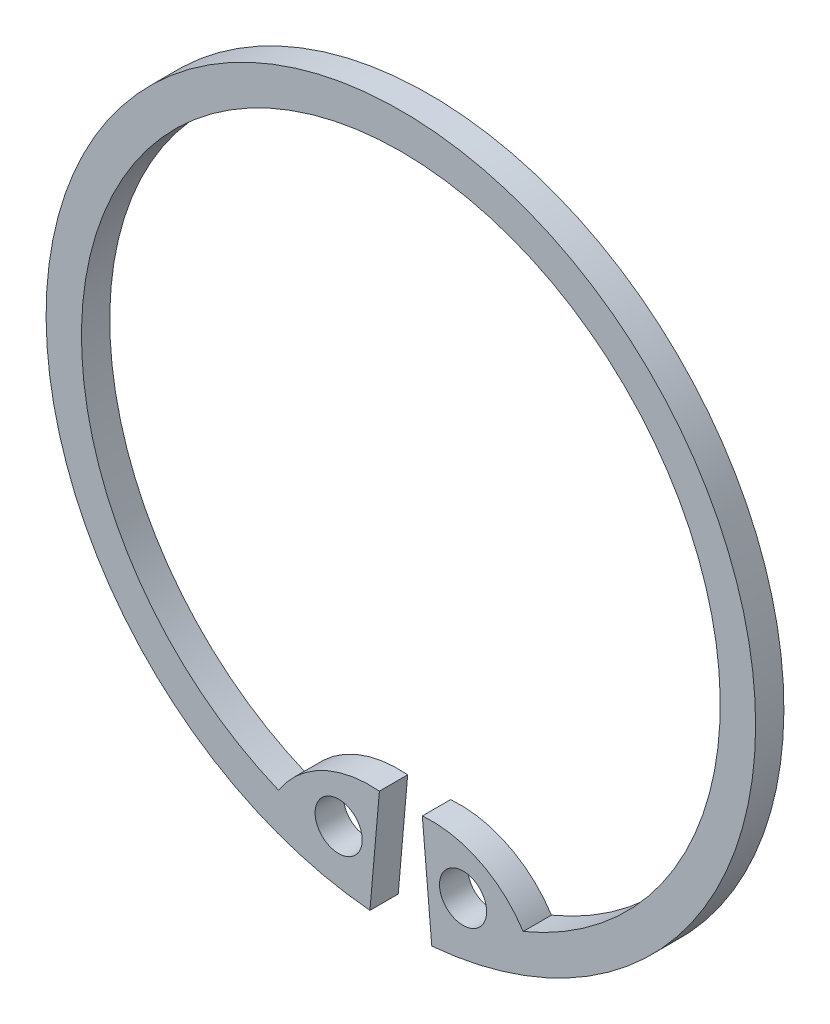
ISO-10303-21;
HEADER;
FILE_DESCRIPTION(('STEP AP214'),'2;1');
FILE_NAME('part.step','',(''),(''),'','','');
FILE_SCHEMA(('AUTOMOTIVE_DESIGN { 1 0 10303 214 1 1 1 1 }'));
ENDSEC;
DATA;
#1=APPLICATION_CONTEXT('core data for automotive mechanical design processes');
#2=APPLICATION_PROTOCOL_DEFINITION('international standard','automotive_design',2000,#1);
#3=PRODUCT_CONTEXT('',#1,'mechanical');
#4=PRODUCT('Part','Part','',(#3));
#5=PRODUCT_RELATED_PRODUCT_CATEGORY('part','',(#4));
#6=PRODUCT_DEFINITION_FORMATION('','',#4);
#7=PRODUCT_DEFINITION_CONTEXT('part definition',#1,'design');
#8=PRODUCT_DEFINITION('design','',#6,#7);
#9=PRODUCT_DEFINITION_SHAPE('','',#8);
#10=(LENGTH_UNIT() NAMED_UNIT(*) SI_UNIT(.MILLI.,.METRE.));
#11=(NAMED_UNIT(*) PLANE_ANGLE_UNIT() SI_UNIT($,.RADIAN.));
#12=(NAMED_UNIT(*) SI_UNIT($,.STERADIAN.) SOLID_ANGLE_UNIT());
#13=UNCERTAINTY_MEASURE_WITH_UNIT(LENGTH_MEASURE(1.E-05),#10,'distance_accuracy_value','');
#14=(GEOMETRIC_REPRESENTATION_CONTEXT(3) GLOBAL_UNCERTAINTY_ASSIGNED_CONTEXT((#13)) GLOBAL_UNIT_ASSIGNED_CONTEXT((#10,
#11,#12)) REPRESENTATION_CONTEXT('',''));
#15=CARTESIAN_POINT('',(0.,0.,0.));
#16=DIRECTION('',(0.,0.,1.));
#17=DIRECTION('',(1.,0.,0.));
#18=AXIS2_PLACEMENT_3D('',#15,#16,#17);
#19=CARTESIAN_POINT('',(0.,0.,1.2));
#20=DIRECTION('',(0.,0.,1.));
#21=DIRECTION('',(1.,0.,0.));
#22=AXIS2_PLACEMENT_3D('',#19,#20,#21);
#23=PLANE('',#22);
#24=CARTESIAN_POINT('',(2.63873425710665,-12.5678435951233,1.2));
#25=DIRECTION('',(0.,0.,1.));
#26=DIRECTION('',(1.,0.,0.));
#27=AXIS2_PLACEMENT_3D('',#24,#25,#26);
#28=CIRCLE('',#27,1.);
#29=CARTESIAN_POINT('',(3.63873425710665,-12.5678435951233,1.2));
#30=VERTEX_POINT('',#29);
#31=EDGE_CURVE('E122',#30,#30,#28,.T.);
#32=ORIENTED_EDGE('',*,*,#31,.F.);
#33=EDGE_LOOP('',(#32));
#34=FACE_BOUND('',#33,.T.);
#35=CARTESIAN_POINT('',(0.,0.,1.2));
#36=DIRECTION('',(0.,0.,1.));
#37=DIRECTION('',(1.,0.,0.));
#38=AXIS2_PLACEMENT_3D('',#35,#36,#37);
#39=CIRCLE('',#38,15.05);
#40=CARTESIAN_POINT('',(1.31169392835226,-14.9927302062808,1.2));
#41=VERTEX_POINT('',#40);
#42=CARTESIAN_POINT('',(-1.31169392835226,-14.9927302062808,1.2));
#43=VERTEX_POINT('',#42);
#44=EDGE_CURVE('E129',#41,#43,#39,.T.);
#45=ORIENTED_EDGE('',*,*,#44,.T.);
#46=DIRECTION('',(0.0871557427476582,0.996194698091745,0.));
#47=VECTOR('',#46,1.);
#48=CARTESIAN_POINT('',(-1.31169392835226,-14.9927302062808,1.2));
#49=LINE('',#48,#47);
#50=CARTESIAN_POINT('',(-0.910777511713028,-10.4102345950587,1.2));
#51=VERTEX_POINT('',#50);
#52=EDGE_CURVE('E87',#43,#51,#49,.T.);
#53=ORIENTED_EDGE('',*,*,#52,.T.);
#54=CARTESIAN_POINT('',(-1.31169392835226,-14.9927302062808,1.2));
#55=DIRECTION('',(0.,0.,1.));
#56=DIRECTION('',(1.,0.,0.));
#57=AXIS2_PLACEMENT_3D('',#54,#55,#56);
#58=CIRCLE('',#57,4.6);
#59=CARTESIAN_POINT('',(-5.18875040683786,-12.5171629858982,1.2));
#60=VERTEX_POINT('',#59);
#61=EDGE_CURVE('E100',#51,#60,#58,.T.);
#62=ORIENTED_EDGE('',*,*,#61,.T.);
#63=CARTESIAN_POINT('',(0.,0.,1.2));
#64=DIRECTION('',(0.,0.,-1.));
#65=DIRECTION('',(-1.,0.,0.));
#66=AXIS2_PLACEMENT_3D('',#63,#64,#65);
#67=CIRCLE('',#66,13.55);
#68=CARTESIAN_POINT('',(5.18875040683787,-12.5171629858982,1.2));
#69=VERTEX_POINT('',#68);
#70=EDGE_CURVE('E94',#60,#69,#67,.T.);
#71=ORIENTED_EDGE('',*,*,#70,.T.);
#72=CARTESIAN_POINT('',(1.31169392835226,-14.9927302062808,1.2));
#73=DIRECTION('',(0.,0.,1.));
#74=DIRECTION('',(1.,0.,0.));
#75=AXIS2_PLACEMENT_3D('',#72,#73,#74);
#76=CIRCLE('',#75,4.6);
#77=CARTESIAN_POINT('',(0.910777511713028,-10.4102345950587,1.2));
#78=VERTEX_POINT('',#77);
#79=EDGE_CURVE('E98',#69,#78,#76,.T.);
#80=ORIENTED_EDGE('',*,*,#79,.T.);
#81=DIRECTION('',(0.0871557427476581,-0.996194698091745,0.));
#82=VECTOR('',#81,1.);
#83=CARTESIAN_POINT('',(0.910777511713028,-10.4102345950587,1.2));
#84=LINE('',#83,#82);
#85=EDGE_CURVE('E50',#78,#41,#84,.T.);
#86=ORIENTED_EDGE('',*,*,#85,.T.);
#87=EDGE_LOOP('',(#45,#53,#62,#71,#80,#86));
#88=FACE_BOUND('',#87,.T.);
#89=CARTESIAN_POINT('',(-2.63873425710665,-12.5678435951233,1.2));
#90=DIRECTION('',(0.,0.,1.));
#91=DIRECTION('',(1.,0.,0.));
#92=AXIS2_PLACEMENT_3D('',#89,#90,#91);
#93=CIRCLE('',#92,1.);
#94=CARTESIAN_POINT('',(-1.63873425710665,-12.5678435951233,1.2));
#95=VERTEX_POINT('',#94);
#96=EDGE_CURVE('E172',#95,#95,#93,.T.);
#97=ORIENTED_EDGE('',*,*,#96,.F.);
#98=EDGE_LOOP('',(#97));
#99=FACE_BOUND('',#98,.T.);
#100=ADVANCED_FACE('F33',(#34,#88,#99),#23,.T.);
#101=CARTESIAN_POINT('',(0.,0.,0.));
#102=DIRECTION('',(0.,0.,1.));
#103=DIRECTION('',(1.,0.,0.));
#104=AXIS2_PLACEMENT_3D('',#101,#102,#103);
#105=PLANE('',#104);
#106=CARTESIAN_POINT('',(2.63873425710665,-12.5678435951233,0.));
#107=DIRECTION('',(0.,0.,1.));
#108=DIRECTION('',(1.,0.,0.));
#109=AXIS2_PLACEMENT_3D('',#106,#107,#108);
#110=CIRCLE('',#109,1.);
#111=CARTESIAN_POINT('',(3.63873425710665,-12.5678435951233,0.));
#112=VERTEX_POINT('',#111);
#113=EDGE_CURVE('E177',#112,#112,#110,.T.);
#114=ORIENTED_EDGE('',*,*,#113,.T.);
#115=EDGE_LOOP('',(#114));
#116=FACE_BOUND('',#115,.T.);
#117=CARTESIAN_POINT('',(0.,0.,0.));
#118=DIRECTION('',(0.,0.,1.));
#119=DIRECTION('',(1.,0.,0.));
#120=AXIS2_PLACEMENT_3D('',#117,#118,#119);
#121=CIRCLE('',#120,15.05);
#122=CARTESIAN_POINT('',(1.31169392835226,-14.9927302062808,0.));
#123=VERTEX_POINT('',#122);
#124=CARTESIAN_POINT('',(-1.31169392835226,-14.9927302062808,0.));
#125=VERTEX_POINT('',#124);
#126=EDGE_CURVE('E118',#123,#125,#121,.T.);
#127=ORIENTED_EDGE('',*,*,#126,.F.);
#128=DIRECTION('',(0.0871557427476581,-0.996194698091745,0.));
#129=VECTOR('',#128,1.);
#130=CARTESIAN_POINT('',(0.910777511713028,-10.4102345950587,0.));
#131=LINE('',#130,#129);
#132=CARTESIAN_POINT('',(0.910777511713028,-10.4102345950587,0.));
#133=VERTEX_POINT('',#132);
#134=EDGE_CURVE('E79',#133,#123,#131,.T.);
#135=ORIENTED_EDGE('',*,*,#134,.F.);
#136=CARTESIAN_POINT('',(1.31169392835226,-14.9927302062808,0.));
#137=DIRECTION('',(0.,0.,1.));
#138=DIRECTION('',(1.,0.,0.));
#139=AXIS2_PLACEMENT_3D('',#136,#137,#138);
#140=CIRCLE('',#139,4.6);
#141=CARTESIAN_POINT('',(5.18875040683787,-12.5171629858982,0.));
#142=VERTEX_POINT('',#141);
#143=EDGE_CURVE('E73',#142,#133,#140,.T.);
#144=ORIENTED_EDGE('',*,*,#143,.F.);
#145=CARTESIAN_POINT('',(0.,0.,0.));
#146=DIRECTION('',(0.,0.,-1.));
#147=DIRECTION('',(-1.,0.,0.));
#148=AXIS2_PLACEMENT_3D('',#145,#146,#147);
#149=CIRCLE('',#148,13.55);
#150=CARTESIAN_POINT('',(-5.18875040683786,-12.5171629858982,0.));
#151=VERTEX_POINT('',#150);
#152=EDGE_CURVE('E108',#151,#142,#149,.T.);
#153=ORIENTED_EDGE('',*,*,#152,.F.);
#154=CARTESIAN_POINT('',(-1.31169392835226,-14.9927302062808,0.));
#155=DIRECTION('',(0.,0.,1.));
#156=DIRECTION('',(1.,0.,0.));
#157=AXIS2_PLACEMENT_3D('',#154,#155,#156);
#158=CIRCLE('',#157,4.6);
#159=CARTESIAN_POINT('',(-0.910777511713028,-10.4102345950587,0.));
#160=VERTEX_POINT('',#159);
#161=EDGE_CURVE('E124',#160,#151,#158,.T.);
#162=ORIENTED_EDGE('',*,*,#161,.F.);
#163=DIRECTION('',(0.0871557427476582,0.996194698091745,0.));
#164=VECTOR('',#163,1.);
#165=CARTESIAN_POINT('',(-1.31169392835226,-14.9927302062808,0.));
#166=LINE('',#165,#164);
#167=EDGE_CURVE('E121',#125,#160,#166,.T.);
#168=ORIENTED_EDGE('',*,*,#167,.F.);
#169=EDGE_LOOP('',(#127,#135,#144,#153,#162,#168));
#170=FACE_BOUND('',#169,.T.);
#171=CARTESIAN_POINT('',(-2.63873425710665,-12.5678435951233,0.));
#172=DIRECTION('',(0.,0.,1.));
#173=DIRECTION('',(1.,0.,0.));
#174=AXIS2_PLACEMENT_3D('',#171,#172,#173);
#175=CIRCLE('',#174,1.);
#176=CARTESIAN_POINT('',(-1.63873425710665,-12.5678435951233,0.));
#177=VERTEX_POINT('',#176);
#178=EDGE_CURVE('E175',#177,#177,#175,.T.);
#179=ORIENTED_EDGE('',*,*,#178,.T.);
#180=EDGE_LOOP('',(#179));
#181=FACE_BOUND('',#180,.T.);
#182=ADVANCED_FACE('F138',(#116,#170,#181),#105,.F.);
#183=CARTESIAN_POINT('',(0.,0.,1.2));
#184=DIRECTION('',(0.,0.,-1.));
#185=DIRECTION('',(-1.,0.,0.));
#186=AXIS2_PLACEMENT_3D('',#183,#184,#185);
#187=CYLINDRICAL_SURFACE('',#186,15.05);
#188=ORIENTED_EDGE('',*,*,#126,.T.);
#189=DIRECTION('',(0.,0.,-1.));
#190=VECTOR('',#189,1.);
#191=CARTESIAN_POINT('',(-1.31169392835226,-14.9927302062808,1.2));
#192=LINE('',#191,#190);
#193=EDGE_CURVE('E11',#43,#125,#192,.T.);
#194=ORIENTED_EDGE('',*,*,#193,.F.);
#195=ORIENTED_EDGE('',*,*,#44,.F.);
#196=DIRECTION('',(0.,0.,-1.));
#197=VECTOR('',#196,1.);
#198=CARTESIAN_POINT('',(1.31169392835226,-14.9927302062808,1.2));
#199=LINE('',#198,#197);
#200=EDGE_CURVE('E114',#41,#123,#199,.T.);
#201=ORIENTED_EDGE('',*,*,#200,.T.);
#202=EDGE_LOOP('',(#188,#194,#195,#201));
#203=FACE_BOUND('',#202,.T.);
#204=ADVANCED_FACE('F35',(#203),#187,.T.);
#205=CARTESIAN_POINT('',(-1.31169392835226,-14.9927302062808,1.2));
#206=DIRECTION('',(-0.996194698091745,0.0871557427476582,0.));
#207=DIRECTION('',(-0.0871557427476582,-0.996194698091746,0.));
#208=AXIS2_PLACEMENT_3D('',#205,#206,#207);
#209=PLANE('',#208);
#210=ORIENTED_EDGE('',*,*,#167,.T.);
#211=DIRECTION('',(0.,0.,-1.));
#212=VECTOR('',#211,1.);
#213=CARTESIAN_POINT('',(-0.910777511713028,-10.4102345950587,1.2));
#214=LINE('',#213,#212);
#215=EDGE_CURVE('E42',#51,#160,#214,.T.);
#216=ORIENTED_EDGE('',*,*,#215,.F.);
#217=ORIENTED_EDGE('',*,*,#52,.F.);
#218=ORIENTED_EDGE('',*,*,#193,.T.);
#219=EDGE_LOOP('',(#210,#216,#217,#218));
#220=FACE_BOUND('',#219,.T.);
#221=ADVANCED_FACE('F218',(#220),#209,.F.);
#222=CARTESIAN_POINT('',(-1.31169392835226,-14.9927302062808,1.2));
#223=DIRECTION('',(0.,0.,-1.));
#224=DIRECTION('',(-1.,0.,0.));
#225=AXIS2_PLACEMENT_3D('',#222,#223,#224);
#226=CYLINDRICAL_SURFACE('',#225,4.6);
#227=ORIENTED_EDGE('',*,*,#161,.T.);
#228=DIRECTION('',(0.,0.,-1.));
#229=VECTOR('',#228,1.);
#230=CARTESIAN_POINT('',(-5.18875040683786,-12.5171629858982,1.2));
#231=LINE('',#230,#229);
#232=EDGE_CURVE('E109',#60,#151,#231,.T.);
#233=ORIENTED_EDGE('',*,*,#232,.F.);
#234=ORIENTED_EDGE('',*,*,#61,.F.);
#235=ORIENTED_EDGE('',*,*,#215,.T.);
#236=EDGE_LOOP('',(#227,#233,#234,#235));
#237=FACE_BOUND('',#236,.T.);
#238=ADVANCED_FACE('F135',(#237),#226,.T.);
#239=CARTESIAN_POINT('',(0.,0.,1.2));
#240=DIRECTION('',(0.,0.,-1.));
#241=DIRECTION('',(-1.,0.,0.));
#242=AXIS2_PLACEMENT_3D('',#239,#240,#241);
#243=CYLINDRICAL_SURFACE('',#242,13.55);
#244=ORIENTED_EDGE('',*,*,#152,.T.);
#245=DIRECTION('',(0.,0.,-1.));
#246=VECTOR('',#245,1.);
#247=CARTESIAN_POINT('',(5.18875040683787,-12.5171629858982,1.2));
#248=LINE('',#247,#246);
#249=EDGE_CURVE('E105',#69,#142,#248,.T.);
#250=ORIENTED_EDGE('',*,*,#249,.F.);
#251=ORIENTED_EDGE('',*,*,#70,.F.);
#252=ORIENTED_EDGE('',*,*,#232,.T.);
#253=EDGE_LOOP('',(#244,#250,#251,#252));
#254=FACE_BOUND('',#253,.T.);
#255=ADVANCED_FACE('F106',(#254),#243,.F.);
#256=CARTESIAN_POINT('',(1.31169392835226,-14.9927302062808,1.2));
#257=DIRECTION('',(0.,0.,-1.));
#258=DIRECTION('',(-1.,0.,0.));
#259=AXIS2_PLACEMENT_3D('',#256,#257,#258);
#260=CYLINDRICAL_SURFACE('',#259,4.6);
#261=ORIENTED_EDGE('',*,*,#143,.T.);
#262=DIRECTION('',(0.,0.,-1.));
#263=VECTOR('',#262,1.);
#264=CARTESIAN_POINT('',(0.910777511713028,-10.4102345950587,1.2));
#265=LINE('',#264,#263);
#266=EDGE_CURVE('E110',#78,#133,#265,.T.);
#267=ORIENTED_EDGE('',*,*,#266,.F.);
#268=ORIENTED_EDGE('',*,*,#79,.F.);
#269=ORIENTED_EDGE('',*,*,#249,.T.);
#270=EDGE_LOOP('',(#261,#267,#268,#269));
#271=FACE_BOUND('',#270,.T.);
#272=ADVANCED_FACE('F112',(#271),#260,.T.);
#273=CARTESIAN_POINT('',(0.910777511713028,-10.4102345950587,1.2));
#274=DIRECTION('',(0.996194698091745,0.0871557427476581,0.));
#275=DIRECTION('',(-0.0871557427476582,0.996194698091746,0.));
#276=AXIS2_PLACEMENT_3D('',#273,#274,#275);
#277=PLANE('',#276);
#278=ORIENTED_EDGE('',*,*,#134,.T.);
#279=ORIENTED_EDGE('',*,*,#200,.F.);
#280=ORIENTED_EDGE('',*,*,#85,.F.);
#281=ORIENTED_EDGE('',*,*,#266,.T.);
#282=EDGE_LOOP('',(#278,#279,#280,#281));
#283=FACE_BOUND('',#282,.T.);
#284=ADVANCED_FACE('F143',(#283),#277,.F.);
#285=CARTESIAN_POINT('',(2.63873425710665,-12.5678435951233,1.2));
#286=DIRECTION('',(0.,0.,-1.));
#287=DIRECTION('',(-1.,0.,0.));
#288=AXIS2_PLACEMENT_3D('',#285,#286,#287);
#289=CYLINDRICAL_SURFACE('',#288,1.);
#290=ORIENTED_EDGE('',*,*,#31,.T.);
#291=EDGE_LOOP('',(#290));
#292=FACE_BOUND('',#291,.T.);
#293=ORIENTED_EDGE('',*,*,#113,.F.);
#294=EDGE_LOOP('',(#293));
#295=FACE_BOUND('',#294,.T.);
#296=ADVANCED_FACE('F145',(#292,#295),#289,.F.);
#297=CARTESIAN_POINT('',(-2.63873425710665,-12.5678435951233,1.2));
#298=DIRECTION('',(0.,0.,-1.));
#299=DIRECTION('',(-1.,0.,0.));
#300=AXIS2_PLACEMENT_3D('',#297,#298,#299);
#301=CYLINDRICAL_SURFACE('',#300,1.);
#302=ORIENTED_EDGE('',*,*,#96,.T.);
#303=EDGE_LOOP('',(#302));
#304=FACE_BOUND('',#303,.T.);
#305=ORIENTED_EDGE('',*,*,#178,.F.);
#306=EDGE_LOOP('',(#305));
#307=FACE_BOUND('',#306,.T.);
#308=ADVANCED_FACE('F151',(#304,#307),#301,.F.);
#309=CLOSED_SHELL('',(#100,#182,#204,#221,#238,#255,#272,#284,#296,#308));
#310=MANIFOLD_SOLID_BREP('B2',#309);
#311=ADVANCED_BREP_SHAPE_REPRESENTATION('',(#18,#310),#14);
#312=SHAPE_DEFINITION_REPRESENTATION(#9,#311);
ENDSEC;
END-ISO-10303-21;
